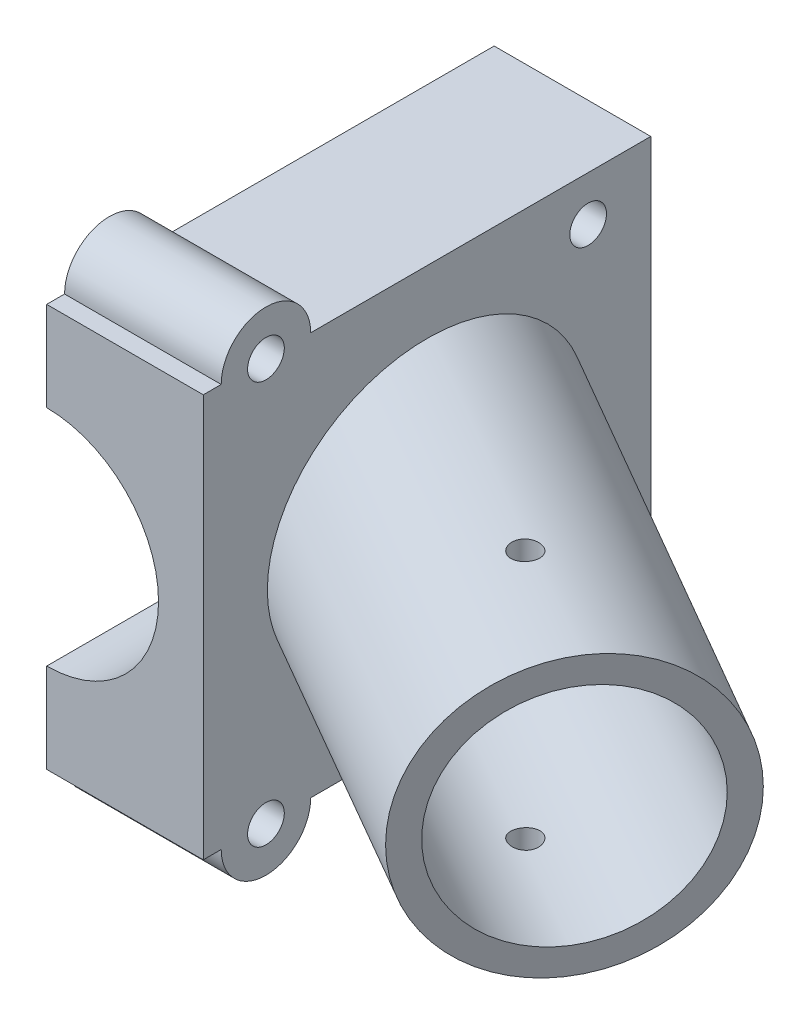
ISO-10303-21;
HEADER;
FILE_DESCRIPTION(('STEP AP214'),'2;1');
FILE_NAME('part.step','',(''),(''),'','','');
FILE_SCHEMA(('AUTOMOTIVE_DESIGN { 1 0 10303 214 1 1 1 1 }'));
ENDSEC;
DATA;
#1=APPLICATION_CONTEXT('core data for automotive mechanical design processes');
#2=APPLICATION_PROTOCOL_DEFINITION('international standard','automotive_design',2000,#1);
#3=PRODUCT_CONTEXT('',#1,'mechanical');
#4=PRODUCT('Part','Part','',(#3));
#5=PRODUCT_RELATED_PRODUCT_CATEGORY('part','',(#4));
#6=PRODUCT_DEFINITION_FORMATION('','',#4);
#7=PRODUCT_DEFINITION_CONTEXT('part definition',#1,'design');
#8=PRODUCT_DEFINITION('design','',#6,#7);
#9=PRODUCT_DEFINITION_SHAPE('','',#8);
#10=(LENGTH_UNIT() NAMED_UNIT(*) SI_UNIT(.MILLI.,.METRE.));
#11=(NAMED_UNIT(*) PLANE_ANGLE_UNIT() SI_UNIT($,.RADIAN.));
#12=(NAMED_UNIT(*) SI_UNIT($,.STERADIAN.) SOLID_ANGLE_UNIT());
#13=UNCERTAINTY_MEASURE_WITH_UNIT(LENGTH_MEASURE(1.E-05),#10,'distance_accuracy_value','');
#14=(GEOMETRIC_REPRESENTATION_CONTEXT(3) GLOBAL_UNCERTAINTY_ASSIGNED_CONTEXT((#13)) GLOBAL_UNIT_ASSIGNED_CONTEXT((#10,
#11,#12)) REPRESENTATION_CONTEXT('',''));
#15=CARTESIAN_POINT('',(0.,0.,0.));
#16=DIRECTION('',(0.,0.,1.));
#17=DIRECTION('',(1.,0.,0.));
#18=AXIS2_PLACEMENT_3D('',#15,#16,#17);
#19=CARTESIAN_POINT('',(-17.5,45.,25.));
#20=DIRECTION('',(0.,1.,0.));
#21=DIRECTION('',(0.,0.,1.));
#22=AXIS2_PLACEMENT_3D('',#19,#20,#21);
#23=PLANE('',#22);
#24=DIRECTION('',(0.,0.,1.));
#25=VECTOR('',#24,1.);
#26=CARTESIAN_POINT('',(0.,45.,-25.));
#27=LINE('',#26,#25);
#28=CARTESIAN_POINT('',(0.,45.,-25.));
#29=VERTEX_POINT('',#28);
#30=CARTESIAN_POINT('',(0.,45.,13.));
#31=VERTEX_POINT('',#30);
#32=EDGE_CURVE('E124',#29,#31,#27,.T.);
#33=ORIENTED_EDGE('',*,*,#32,.T.);
#34=DIRECTION('',(-1.,0.,0.));
#35=VECTOR('',#34,1.);
#36=CARTESIAN_POINT('',(17.5,45.,13.));
#37=LINE('',#36,#35);
#38=CARTESIAN_POINT('',(17.5,45.,13.));
#39=VERTEX_POINT('',#38);
#40=EDGE_CURVE('E54',#39,#31,#37,.T.);
#41=ORIENTED_EDGE('',*,*,#40,.F.);
#42=DIRECTION('',(0.,0.,-1.));
#43=VECTOR('',#42,1.);
#44=CARTESIAN_POINT('',(17.5,45.,25.));
#45=LINE('',#44,#43);
#46=CARTESIAN_POINT('',(17.5,45.,-25.));
#47=VERTEX_POINT('',#46);
#48=EDGE_CURVE('E286',#39,#47,#45,.T.);
#49=ORIENTED_EDGE('',*,*,#48,.T.);
#50=DIRECTION('',(1.,0.,0.));
#51=VECTOR('',#50,1.);
#52=CARTESIAN_POINT('',(-17.5,45.,-25.));
#53=LINE('',#52,#51);
#54=EDGE_CURVE('E242',#29,#47,#53,.T.);
#55=ORIENTED_EDGE('',*,*,#54,.F.);
#56=EDGE_LOOP('',(#33,#41,#49,#55));
#57=FACE_BOUND('',#56,.T.);
#58=ADVANCED_FACE('F37',(#57),#23,.T.);
#59=CARTESIAN_POINT('',(17.5,45.,25.));
#60=VERTEX_POINT('',#59);
#61=CARTESIAN_POINT('',(17.5,45.,23.));
#62=VERTEX_POINT('',#61);
#63=EDGE_CURVE('E62',#60,#62,#45,.T.);
#64=ORIENTED_EDGE('',*,*,#63,.T.);
#65=DIRECTION('',(-1.,0.,0.));
#66=VECTOR('',#65,1.);
#67=CARTESIAN_POINT('',(17.5,45.,23.));
#68=LINE('',#67,#66);
#69=CARTESIAN_POINT('',(0.,45.,23.));
#70=VERTEX_POINT('',#69);
#71=EDGE_CURVE('E128',#62,#70,#68,.T.);
#72=ORIENTED_EDGE('',*,*,#71,.T.);
#73=CARTESIAN_POINT('',(0.,45.,25.));
#74=VERTEX_POINT('',#73);
#75=EDGE_CURVE('E117',#70,#74,#27,.T.);
#76=ORIENTED_EDGE('',*,*,#75,.T.);
#77=DIRECTION('',(1.,0.,0.));
#78=VECTOR('',#77,1.);
#79=CARTESIAN_POINT('',(-17.5,45.,25.));
#80=LINE('',#79,#78);
#81=EDGE_CURVE('E288',#74,#60,#80,.T.);
#82=ORIENTED_EDGE('',*,*,#81,.T.);
#83=EDGE_LOOP('',(#64,#72,#76,#82));
#84=FACE_BOUND('',#83,.T.);
#85=ADVANCED_FACE('F129',(#84),#23,.T.);
#86=CARTESIAN_POINT('',(-17.5,0.,25.));
#87=DIRECTION('',(0.,1.,0.));
#88=DIRECTION('',(0.,0.,1.));
#89=AXIS2_PLACEMENT_3D('',#86,#87,#88);
#90=PLANE('',#89);
#91=DIRECTION('',(0.,0.,-1.));
#92=VECTOR('',#91,1.);
#93=CARTESIAN_POINT('',(17.5,0.,25.));
#94=LINE('',#93,#92);
#95=CARTESIAN_POINT('',(17.5,0.,13.));
#96=VERTEX_POINT('',#95);
#97=CARTESIAN_POINT('',(17.5,0.,-25.));
#98=VERTEX_POINT('',#97);
#99=EDGE_CURVE('E46',#96,#98,#94,.T.);
#100=ORIENTED_EDGE('',*,*,#99,.F.);
#101=DIRECTION('',(-1.,0.,0.));
#102=VECTOR('',#101,1.);
#103=CARTESIAN_POINT('',(17.5,0.,13.));
#104=LINE('',#103,#102);
#105=CARTESIAN_POINT('',(0.,0.,13.));
#106=VERTEX_POINT('',#105);
#107=EDGE_CURVE('E156',#96,#106,#104,.T.);
#108=ORIENTED_EDGE('',*,*,#107,.T.);
#109=DIRECTION('',(0.,0.,-1.));
#110=VECTOR('',#109,1.);
#111=CARTESIAN_POINT('',(0.,0.,-25.));
#112=LINE('',#111,#110);
#113=CARTESIAN_POINT('',(0.,0.,-25.));
#114=VERTEX_POINT('',#113);
#115=EDGE_CURVE('E166',#106,#114,#112,.T.);
#116=ORIENTED_EDGE('',*,*,#115,.T.);
#117=DIRECTION('',(1.,0.,0.));
#118=VECTOR('',#117,1.);
#119=CARTESIAN_POINT('',(-17.5,0.,-25.));
#120=LINE('',#119,#118);
#121=EDGE_CURVE('E260',#114,#98,#120,.T.);
#122=ORIENTED_EDGE('',*,*,#121,.T.);
#123=EDGE_LOOP('',(#100,#108,#116,#122));
#124=FACE_BOUND('',#123,.T.);
#125=ADVANCED_FACE('F239',(#124),#90,.F.);
#126=CARTESIAN_POINT('',(0.,0.,25.));
#127=VERTEX_POINT('',#126);
#128=CARTESIAN_POINT('',(0.,0.,23.));
#129=VERTEX_POINT('',#128);
#130=EDGE_CURVE('E167',#127,#129,#112,.T.);
#131=ORIENTED_EDGE('',*,*,#130,.T.);
#132=DIRECTION('',(-1.,0.,0.));
#133=VECTOR('',#132,1.);
#134=CARTESIAN_POINT('',(17.5,0.,23.));
#135=LINE('',#134,#133);
#136=CARTESIAN_POINT('',(17.5,0.,23.));
#137=VERTEX_POINT('',#136);
#138=EDGE_CURVE('E153',#137,#129,#135,.T.);
#139=ORIENTED_EDGE('',*,*,#138,.F.);
#140=CARTESIAN_POINT('',(17.5,0.,25.));
#141=VERTEX_POINT('',#140);
#142=EDGE_CURVE('E11',#141,#137,#94,.T.);
#143=ORIENTED_EDGE('',*,*,#142,.F.);
#144=DIRECTION('',(1.,0.,0.));
#145=VECTOR('',#144,1.);
#146=CARTESIAN_POINT('',(-17.5,0.,25.));
#147=LINE('',#146,#145);
#148=EDGE_CURVE('E255',#127,#141,#147,.T.);
#149=ORIENTED_EDGE('',*,*,#148,.F.);
#150=EDGE_LOOP('',(#131,#139,#143,#149));
#151=FACE_BOUND('',#150,.T.);
#152=ADVANCED_FACE('F39',(#151),#90,.F.);
#153=CARTESIAN_POINT('',(0.,22.5,25.));
#154=DIRECTION('',(0.,0.,-1.));
#155=DIRECTION('',(-1.,0.,0.));
#156=AXIS2_PLACEMENT_3D('',#153,#154,#155);
#157=CYLINDRICAL_SURFACE('',#156,12.5);
#158=DIRECTION('',(0.,0.,-1.));
#159=VECTOR('',#158,1.);
#160=CARTESIAN_POINT('',(0.,35.,25.));
#161=LINE('',#160,#159);
#162=CARTESIAN_POINT('',(0.,35.,-25.));
#163=VERTEX_POINT('',#162);
#164=CARTESIAN_POINT('',(0.,35.,25.));
#165=VERTEX_POINT('',#164);
#166=EDGE_CURVE('E174',#163,#165,#161,.F.);
#167=ORIENTED_EDGE('',*,*,#166,.F.);
#168=CARTESIAN_POINT('',(0.,22.5,-25.));
#169=DIRECTION('',(0.,0.,-1.));
#170=DIRECTION('',(1.,0.,0.));
#171=AXIS2_PLACEMENT_3D('',#168,#169,#170);
#172=CIRCLE('',#171,12.5);
#173=CARTESIAN_POINT('',(0.,10.,-25.));
#174=VERTEX_POINT('',#173);
#175=EDGE_CURVE('E250',#163,#174,#172,.T.);
#176=ORIENTED_EDGE('',*,*,#175,.T.);
#177=DIRECTION('',(0.,0.,-1.));
#178=VECTOR('',#177,1.);
#179=CARTESIAN_POINT('',(0.,10.,25.));
#180=LINE('',#179,#178);
#181=CARTESIAN_POINT('',(0.,10.,25.));
#182=VERTEX_POINT('',#181);
#183=EDGE_CURVE('E172',#182,#174,#180,.T.);
#184=ORIENTED_EDGE('',*,*,#183,.F.);
#185=CARTESIAN_POINT('',(0.,22.5,25.));
#186=DIRECTION('',(0.,0.,-1.));
#187=DIRECTION('',(1.,0.,0.));
#188=AXIS2_PLACEMENT_3D('',#185,#186,#187);
#189=CIRCLE('',#188,12.5);
#190=EDGE_CURVE('E266',#165,#182,#189,.T.);
#191=ORIENTED_EDGE('',*,*,#190,.F.);
#192=EDGE_LOOP('',(#167,#176,#184,#191));
#193=FACE_BOUND('',#192,.T.);
#194=ADVANCED_FACE('F424',(#193),#157,.F.);
#195=CARTESIAN_POINT('',(0.,22.5,25.));
#196=DIRECTION('',(0.,0.,1.));
#197=DIRECTION('',(1.,0.,0.));
#198=AXIS2_PLACEMENT_3D('',#195,#196,#197);
#199=PLANE('',#198);
#200=ORIENTED_EDGE('',*,*,#81,.F.);
#201=DIRECTION('',(0.,-1.,0.));
#202=VECTOR('',#201,1.);
#203=CARTESIAN_POINT('',(0.,45.,25.));
#204=LINE('',#203,#202);
#205=EDGE_CURVE('E122',#74,#165,#204,.T.);
#206=ORIENTED_EDGE('',*,*,#205,.T.);
#207=ORIENTED_EDGE('',*,*,#190,.T.);
#208=EDGE_CURVE('E164',#182,#127,#204,.T.);
#209=ORIENTED_EDGE('',*,*,#208,.T.);
#210=ORIENTED_EDGE('',*,*,#148,.T.);
#211=DIRECTION('',(0.,1.,0.));
#212=VECTOR('',#211,1.);
#213=CARTESIAN_POINT('',(17.5,0.,25.));
#214=LINE('',#213,#212);
#215=EDGE_CURVE('E258',#141,#60,#214,.T.);
#216=ORIENTED_EDGE('',*,*,#215,.T.);
#217=EDGE_LOOP('',(#200,#206,#207,#209,#210,#216));
#218=FACE_BOUND('',#217,.T.);
#219=ADVANCED_FACE('F433',(#218),#199,.T.);
#220=CARTESIAN_POINT('',(0.,22.5,-25.));
#221=DIRECTION('',(0.,0.,1.));
#222=DIRECTION('',(1.,0.,0.));
#223=AXIS2_PLACEMENT_3D('',#220,#221,#222);
#224=PLANE('',#223);
#225=DIRECTION('',(0.,1.,0.));
#226=VECTOR('',#225,1.);
#227=CARTESIAN_POINT('',(0.,45.,-25.));
#228=LINE('',#227,#226);
#229=EDGE_CURVE('E159',#163,#29,#228,.T.);
#230=ORIENTED_EDGE('',*,*,#229,.T.);
#231=ORIENTED_EDGE('',*,*,#54,.T.);
#232=DIRECTION('',(0.,1.,0.));
#233=VECTOR('',#232,1.);
#234=CARTESIAN_POINT('',(17.5,0.,-25.));
#235=LINE('',#234,#233);
#236=EDGE_CURVE('E256',#98,#47,#235,.T.);
#237=ORIENTED_EDGE('',*,*,#236,.F.);
#238=ORIENTED_EDGE('',*,*,#121,.F.);
#239=EDGE_CURVE('E125',#114,#174,#228,.T.);
#240=ORIENTED_EDGE('',*,*,#239,.T.);
#241=ORIENTED_EDGE('',*,*,#175,.F.);
#242=EDGE_LOOP('',(#230,#231,#237,#238,#240,#241));
#243=FACE_BOUND('',#242,.T.);
#244=ADVANCED_FACE('F231',(#243),#224,.F.);
#245=CARTESIAN_POINT('',(23.2982756057297,5.,-18.));
#246=DIRECTION('',(-1.,0.,0.));
#247=DIRECTION('',(0.,0.,1.));
#248=AXIS2_PLACEMENT_3D('',#245,#246,#247);
#249=CYLINDRICAL_SURFACE('',#248,2.05);
#250=CARTESIAN_POINT('',(17.5,5.,-18.));
#251=DIRECTION('',(-1.,0.,0.));
#252=DIRECTION('',(0.,0.,1.));
#253=AXIS2_PLACEMENT_3D('',#250,#251,#252);
#254=CIRCLE('',#253,2.05);
#255=CARTESIAN_POINT('',(17.5,5.,-15.95));
#256=VERTEX_POINT('',#255);
#257=EDGE_CURVE('E279',#256,#256,#254,.F.);
#258=ORIENTED_EDGE('',*,*,#257,.T.);
#259=EDGE_LOOP('',(#258));
#260=FACE_BOUND('',#259,.T.);
#261=CARTESIAN_POINT('',(0.,5.,-18.));
#262=DIRECTION('',(-1.,0.,0.));
#263=DIRECTION('',(0.,0.,1.));
#264=AXIS2_PLACEMENT_3D('',#261,#262,#263);
#265=CIRCLE('',#264,2.05);
#266=CARTESIAN_POINT('',(0.,5.,-15.95));
#267=VERTEX_POINT('',#266);
#268=EDGE_CURVE('E169',#267,#267,#265,.F.);
#269=ORIENTED_EDGE('',*,*,#268,.F.);
#270=EDGE_LOOP('',(#269));
#271=FACE_BOUND('',#270,.T.);
#272=ADVANCED_FACE('F228',(#260,#271),#249,.F.);
#273=CARTESIAN_POINT('',(23.2982756057297,40.,-18.));
#274=DIRECTION('',(-1.,0.,0.));
#275=DIRECTION('',(0.,0.,1.));
#276=AXIS2_PLACEMENT_3D('',#273,#274,#275);
#277=CYLINDRICAL_SURFACE('',#276,2.05);
#278=CARTESIAN_POINT('',(17.5,40.,-18.));
#279=DIRECTION('',(-1.,0.,0.));
#280=DIRECTION('',(0.,0.,1.));
#281=AXIS2_PLACEMENT_3D('',#278,#279,#280);
#282=CIRCLE('',#281,2.05);
#283=CARTESIAN_POINT('',(17.5,40.,-15.95));
#284=VERTEX_POINT('',#283);
#285=EDGE_CURVE('E289',#284,#284,#282,.T.);
#286=ORIENTED_EDGE('',*,*,#285,.F.);
#287=EDGE_LOOP('',(#286));
#288=FACE_BOUND('',#287,.T.);
#289=CARTESIAN_POINT('',(0.,40.,-18.));
#290=DIRECTION('',(-1.,0.,0.));
#291=DIRECTION('',(0.,0.,1.));
#292=AXIS2_PLACEMENT_3D('',#289,#290,#291);
#293=CIRCLE('',#292,2.05);
#294=CARTESIAN_POINT('',(0.,40.,-15.95));
#295=VERTEX_POINT('',#294);
#296=EDGE_CURVE('E41',#295,#295,#293,.T.);
#297=ORIENTED_EDGE('',*,*,#296,.T.);
#298=EDGE_LOOP('',(#297));
#299=FACE_BOUND('',#298,.T.);
#300=ADVANCED_FACE('F203',(#288,#299),#277,.F.);
#301=CARTESIAN_POINT('',(56.4711431702997,22.5,22.5));
#302=DIRECTION('',(-0.866025403784438,0.,-0.500000000000001));
#303=DIRECTION('',(-0.500000000000001,0.,0.866025403784438));
#304=AXIS2_PLACEMENT_3D('',#301,#302,#303);
#305=CYLINDRICAL_SURFACE('',#304,15.45);
#306=CARTESIAN_POINT('',(17.5,22.5,0.));
#307=DIRECTION('',(-1.,0.,0.));
#308=DIRECTION('',(0.,0.,1.));
#309=AXIS2_PLACEMENT_3D('',#306,#307,#308);
#310=ELLIPSE('',#309,17.8401233179594,15.45);
#311=CARTESIAN_POINT('',(17.5,22.5,17.8401233179594));
#312=VERTEX_POINT('',#311);
#313=EDGE_CURVE('E276',#312,#312,#310,.F.);
#314=ORIENTED_EDGE('',*,*,#313,.T.);
#315=EDGE_LOOP('',(#314));
#316=FACE_BOUND('',#315,.T.);
#317=CARTESIAN_POINT('',(56.4711431702997,22.5,22.5));
#318=DIRECTION('',(0.866025403784438,0.,0.500000000000001));
#319=DIRECTION('',(0.500000000000001,0.,-0.866025403784438));
#320=AXIS2_PLACEMENT_3D('',#317,#318,#319);
#321=CIRCLE('',#320,15.45);
#322=CARTESIAN_POINT('',(64.1961431702997,22.5,9.11990751153048));
#323=VERTEX_POINT('',#322);
#324=EDGE_CURVE('E273',#323,#323,#321,.T.);
#325=ORIENTED_EDGE('',*,*,#324,.F.);
#326=EDGE_LOOP('',(#325));
#327=FACE_BOUND('',#326,.T.);
#328=CARTESIAN_POINT('',(43.4807621135331,7.10842357001727,13.45));
#329=CARTESIAN_POINT('',(43.5675140295861,7.11220583738731,13.4500035997905));
#330=CARTESIAN_POINT('',(43.6543379159049,7.11562296943198,13.4573063746119));
#331=CARTESIAN_POINT('',(43.8256389747913,7.12133717153386,13.4863548257459));
#332=CARTESIAN_POINT('',(43.9101136080419,7.1236330708784,13.5081155423256));
#333=CARTESIAN_POINT('',(44.0742346666666,7.1268400737668,13.5654820639701));
#334=CARTESIAN_POINT('',(44.1538823985694,7.12775155366233,13.6010841029924));
#335=CARTESIAN_POINT('',(44.3060733729751,7.12808628577108,13.6851172850177));
#336=CARTESIAN_POINT('',(44.378618213825,7.12750987360376,13.733545532639));
#337=CARTESIAN_POINT('',(44.5144163267341,7.12493824207385,13.8417342891035));
#338=CARTESIAN_POINT('',(44.5776888801702,7.12294601882526,13.9014706723675));
#339=CARTESIAN_POINT('',(44.6933491155633,7.11777154157267,14.0306448646124));
#340=CARTESIAN_POINT('',(44.7457362425711,7.11458922691985,14.1000831679046));
#341=CARTESIAN_POINT('',(44.8382757589249,7.10738415379465,14.2468717888696));
#342=CARTESIAN_POINT('',(44.8783990669661,7.10335943518408,14.3242403408341));
#343=CARTESIAN_POINT('',(44.9451340363399,7.09492589936488,14.4845815900471));
#344=CARTESIAN_POINT('',(44.9717453337495,7.09051707181469,14.5675544381694));
#345=CARTESIAN_POINT('',(45.0107995600195,7.08178924834297,14.7371511879134));
#346=CARTESIAN_POINT('',(45.0231814364758,7.07747071699288,14.82378918065));
#347=CARTESIAN_POINT('',(45.0332127812373,7.06942882531759,14.9979420868246));
#348=CARTESIAN_POINT('',(45.0308623229923,7.0657054620252,15.0854569958885));
#349=CARTESIAN_POINT('',(45.0114825748386,7.05927470007383,15.2588451918395));
#350=CARTESIAN_POINT('',(44.9944600780094,7.05656683207819,15.3447192196414));
#351=CARTESIAN_POINT('',(44.946212449831,7.05247043465033,15.5124128600441));
#352=CARTESIAN_POINT('',(44.9149877423185,7.05108186585005,15.5942325935564));
#353=CARTESIAN_POINT('',(44.839390493566,7.04978398217956,15.7511174106567));
#354=CARTESIAN_POINT('',(44.7950769672907,7.04986812427901,15.82621088227));
#355=CARTESIAN_POINT('',(44.6945155892028,7.05149012310831,15.9679102178092));
#356=CARTESIAN_POINT('',(44.638267857301,7.05302796523242,16.0345161670038));
#357=CARTESIAN_POINT('',(44.5155392191141,7.05738149042844,16.1572630017084));
#358=CARTESIAN_POINT('',(44.4490738150385,7.06019525008678,16.2134194605));
#359=CARTESIAN_POINT('',(44.3077302186094,7.0667862720625,16.3138261579756));
#360=CARTESIAN_POINT('',(44.2328518131959,7.07056355878435,16.3580760950296));
#361=CARTESIAN_POINT('',(44.0764896286433,7.07867698885687,16.4335880791278));
#362=CARTESIAN_POINT('',(43.9949820945677,7.08301517811672,16.4648007160874));
#363=CARTESIAN_POINT('',(43.8278921416963,7.09175403781342,16.5131308079186));
#364=CARTESIAN_POINT('',(43.7423096327915,7.09615470963042,16.5302479509465));
#365=CARTESIAN_POINT('',(43.5691854767293,7.10453859880149,16.5499339361034));
#366=CARTESIAN_POINT('',(43.4816384135415,7.10852042792001,16.5524558076983));
#367=CARTESIAN_POINT('',(43.307330712838,7.11559857980225,16.5427380048504));
#368=CARTESIAN_POINT('',(43.2205700621672,7.11869491740496,16.530498577794));
#369=CARTESIAN_POINT('',(43.05050908725,7.12364271747174,16.4916340528664));
#370=CARTESIAN_POINT('',(42.967201126629,7.12549708174145,16.4650427520059));
#371=CARTESIAN_POINT('',(42.806216429572,7.1277603748619,16.3982425182165));
#372=CARTESIAN_POINT('',(42.7285395274213,7.12816934626555,16.3580339862223));
#373=CARTESIAN_POINT('',(42.5813608278512,7.1274965531898,16.2653490819092));
#374=CARTESIAN_POINT('',(42.5118254930822,7.12642115578963,16.2129259034996));
#375=CARTESIAN_POINT('',(42.382514820438,7.12291328205902,16.0972149293455));
#376=CARTESIAN_POINT('',(42.3227395248635,7.1204807998471,16.0339270865154));
#377=CARTESIAN_POINT('',(42.2145984550986,7.1145324995053,15.8982532987994));
#378=CARTESIAN_POINT('',(42.166238244703,7.11101615501052,15.8258629435211));
#379=CARTESIAN_POINT('',(42.0823044803245,7.10329596310843,15.6740475103476));
#380=CARTESIAN_POINT('',(42.0467312988571,7.09909209567719,15.594622227593));
#381=CARTESIAN_POINT('',(41.9892255740407,7.09044728423983,15.4305879000182));
#382=CARTESIAN_POINT('',(41.9673549306644,7.0860053614192,15.3459572017134));
#383=CARTESIAN_POINT('',(41.9381220086499,7.0774006677277,15.1742110162948));
#384=CARTESIAN_POINT('',(41.9307599020529,7.07323790016758,15.0870954997287));
#385=CARTESIAN_POINT('',(41.9307643292318,7.0656530558069,14.9126990888248));
#386=CARTESIAN_POINT('',(41.9381529941613,7.06223210051304,14.8254181425712));
#387=CARTESIAN_POINT('',(41.9675126940741,7.05652493606014,14.6533059317627));
#388=CARTESIAN_POINT('',(41.9894833662964,7.05423869867483,14.5684746063225));
#389=CARTESIAN_POINT('',(42.0472841872331,7.05106561364991,14.4040048301446));
#390=CARTESIAN_POINT('',(42.0830617549016,7.05017352097671,14.3243480019454));
#391=CARTESIAN_POINT('',(42.1674637309662,7.04987268612753,14.1721607858153));
#392=CARTESIAN_POINT('',(42.2160874187022,7.0504638607569,14.0996299984307));
#393=CARTESIAN_POINT('',(42.3246100327533,7.05305845427118,13.9639821794381));
#394=CARTESIAN_POINT('',(42.3844717661918,7.05505727287103,13.9008352924126));
#395=CARTESIAN_POINT('',(42.5138878952482,7.06023955594822,13.7854335271845));
#396=CARTESIAN_POINT('',(42.5834446009332,7.06342330306697,13.7331812523211));
#397=CARTESIAN_POINT('',(42.7304714343074,7.07063048254814,13.6409117952916));
#398=CARTESIAN_POINT('',(42.807963109147,7.07465623395722,13.6009291726495));
#399=CARTESIAN_POINT('',(42.9684708041844,7.08308956338435,13.5345357915256));
#400=CARTESIAN_POINT('',(43.0514809228602,7.08749673498069,13.5081107898494));
#401=CARTESIAN_POINT('',(43.192555190309,7.0947540852807,13.4759260490532));
#402=CARTESIAN_POINT('',(43.2497483911587,7.0976352596484,13.4662177711662));
#403=CARTESIAN_POINT('',(43.3648710543732,7.10320647854792,13.4532535286673));
#404=CARTESIAN_POINT('',(43.422800520253,7.10589652216688,13.4499975948705));
#405=CARTESIAN_POINT('',(43.4807621135331,7.10842357001727,13.45));
#406=B_SPLINE_CURVE_WITH_KNOTS('',3,(#328,#329,#330,#331,#332,#333,#334,#335,#336,#337,#338,
#339,#340,#341,#342,#343,#344,#345,#346,#347,#348,#349,#350,#351,#352,#353,#354,#355,#356,#357,
#358,#359,#360,#361,#362,#363,#364,#365,#366,#367,#368,#369,#370,#371,#372,#373,#374,#375,#376,
#377,#378,#379,#380,#381,#382,#383,#384,#385,#386,#387,#388,#389,#390,#391,#392,#393,#394,#395,
#396,#397,#398,#399,#400,#401,#402,#403,#404,#405),.UNSPECIFIED.,.T.,.F.,(4,2,2,2,2,2,2,2,2,2,2,
2,2,2,2,2,2,2,2,2,2,2,2,2,2,2,2,2,2,2,2,2,2,2,2,2,2,2,4),(0.,0.260293142464534,
0.520857486799952,0.781350984550209,1.04178572867939,1.30167098031881,1.56156947790303,
1.82207957745897,2.0825966930388,2.34422745215735,2.60585690688661,2.86736529353185,
3.12886587649076,3.389204948245,3.6495414043264,3.90948670775179,4.16943859579526,
4.43036692776713,4.69130103226855,4.95307441053401,5.21484340176925,5.47599862976599,
5.73714616918847,5.99717701182826,6.25720898142732,6.5173674319739,6.77753346091606,
7.03886644907719,7.3002025360856,7.56193101040645,7.82365297387033,8.08438789932458,
8.3451082008039,8.60498037938904,8.86491458514606,9.12557435757097,9.38595972570651,
9.55986865926971,9.73377842338315),.UNSPECIFIED.);
#407=CARTESIAN_POINT('',(43.4807621135331,7.10842357001727,13.45));
#408=VERTEX_POINT('',#407);
#409=EDGE_CURVE('E177',#408,#408,#406,.T.);
#410=ORIENTED_EDGE('',*,*,#409,.F.);
#411=EDGE_LOOP('',(#410));
#412=FACE_BOUND('',#411,.T.);
#413=CARTESIAN_POINT('',(43.4807621135331,37.8915764299827,13.45));
#414=CARTESIAN_POINT('',(43.3935968068157,37.8953777086965,13.4500036652577));
#415=CARTESIAN_POINT('',(43.3063894202571,37.8995523468866,13.4573764405702));
#416=CARTESIAN_POINT('',(43.1343978183411,37.9081776885007,13.4866731316947));
#417=CARTESIAN_POINT('',(43.0496164848263,37.912628701833,13.5086136599969));
#418=CARTESIAN_POINT('',(42.8849641464831,37.9212997886838,13.566427048775));
#419=CARTESIAN_POINT('',(42.8050910731112,37.9255199594053,13.6022939927914));
#420=CARTESIAN_POINT('',(42.6525036606227,37.9332551561894,13.6869503783984));
#421=CARTESIAN_POINT('',(42.5797875368456,37.9367703582713,13.7357365871794));
#422=CARTESIAN_POINT('',(42.4436338425,37.9426976561187,13.8448094742078));
#423=CARTESIAN_POINT('',(42.3801867090595,37.9451108943315,13.9050841495894));
#424=CARTESIAN_POINT('',(42.2643039248887,37.9485671878837,14.0354607456901));
#425=CARTESIAN_POINT('',(42.2118683565281,37.9496102329739,14.1055627399141));
#426=CARTESIAN_POINT('',(42.1197291505172,37.950206775174,14.2532530539873));
#427=CARTESIAN_POINT('',(42.0799694646575,37.949766931956,14.3308063873812));
#428=CARTESIAN_POINT('',(42.0139903577964,37.9474618445505,14.4914523908725));
#429=CARTESIAN_POINT('',(41.9877708419008,37.9455966103527,14.5745450221442));
#430=CARTESIAN_POINT('',(41.9496169860371,37.9406517192097,14.7438399517257));
#431=CARTESIAN_POINT('',(41.9376711260728,37.9375730442822,14.8300396843853));
#432=CARTESIAN_POINT('',(41.9283423037636,37.9305443984683,15.0031883027995));
#433=CARTESIAN_POINT('',(41.9309597169237,37.9265944051181,15.0901372078132));
#434=CARTESIAN_POINT('',(41.9507108241077,37.9182450869456,15.2627103484147));
#435=CARTESIAN_POINT('',(41.9679039400962,37.9138439877245,15.3483276983853));
#436=CARTESIAN_POINT('',(42.0163987925384,37.9050989383395,15.5154733047995));
#437=CARTESIAN_POINT('',(42.0477008042837,37.9007549892925,15.5970014814209));
#438=CARTESIAN_POINT('',(42.1236454884642,37.8926014402742,15.7538897603206));
#439=CARTESIAN_POINT('',(42.1683236179863,37.8887933005504,15.8292327822195));
#440=CARTESIAN_POINT('',(42.2697382347305,37.8821580205087,15.9713609102221));
#441=CARTESIAN_POINT('',(42.3264744643624,37.879330859238,16.0381461990909));
#442=CARTESIAN_POINT('',(42.4502177351765,37.8749872570702,16.1610602663448));
#443=CARTESIAN_POINT('',(42.517194145441,37.8734669938865,16.2172197437167));
#444=CARTESIAN_POINT('',(42.6596317696677,37.8718970739805,16.3175094203791));
#445=CARTESIAN_POINT('',(42.735092754891,37.8718473776221,16.3616399438531));
#446=CARTESIAN_POINT('',(42.8920235716991,37.8732213699737,16.436458637829));
#447=CARTESIAN_POINT('',(42.9734682517492,37.874639186263,16.4671996910376));
#448=CARTESIAN_POINT('',(43.1403178596144,37.878778148854,16.5146353290782));
#449=CARTESIAN_POINT('',(43.225722821667,37.8814993064253,16.5313297924504));
#450=CARTESIAN_POINT('',(43.3981864798691,37.887941631409,16.5502308792665));
#451=CARTESIAN_POINT('',(43.4852470415569,37.8916639976861,16.5524200527373));
#452=CARTESIAN_POINT('',(43.6584835815492,37.8996890020284,16.5422206096453));
#453=CARTESIAN_POINT('',(43.7446595329477,37.9039916576877,16.5298315509918));
#454=CARTESIAN_POINT('',(43.9141071719572,37.9127162177603,16.4907400965597));
#455=CARTESIAN_POINT('',(43.9973640073051,37.9171385724955,16.4639733949736));
#456=CARTESIAN_POINT('',(44.1582207872548,37.9255868829337,16.3968340716619));
#457=CARTESIAN_POINT('',(44.2358207022808,37.9296128365644,16.356461378807));
#458=CARTESIAN_POINT('',(44.3832273369879,37.9368188127603,16.2631979151317));
#459=CARTESIAN_POINT('',(44.4530277639016,37.9399981550839,16.2102971422436));
#460=CARTESIAN_POINT('',(44.5827635525666,37.9451476920565,16.0934858427298));
#461=CARTESIAN_POINT('',(44.6426991943149,37.9471179210286,16.0295756286959));
#462=CARTESIAN_POINT('',(44.7507544809289,37.9496211449747,15.8928497372571));
#463=CARTESIAN_POINT('',(44.7989217987482,37.9501600289657,15.8200718422116));
#464=CARTESIAN_POINT('',(44.8823804608364,37.9497569422176,15.6674789817399));
#465=CARTESIAN_POINT('',(44.9176720401149,37.9488149985085,15.5876641447859));
#466=CARTESIAN_POINT('',(44.9743064142215,37.9455605906345,15.423492653865));
#467=CARTESIAN_POINT('',(44.9956854037131,37.9432517128172,15.3391484081028));
#468=CARTESIAN_POINT('',(45.0240553078568,37.9375241300638,15.1681108292973));
#469=CARTESIAN_POINT('',(45.0310459137351,37.9341054013123,15.081417445882));
#470=CARTESIAN_POINT('',(45.0304597732999,37.9265273067917,14.9078581432174));
#471=CARTESIAN_POINT('',(45.0228402027159,37.922365796265,14.820992464576));
#472=CARTESIAN_POINT('',(44.9931743110798,37.913773545467,14.6497730993765));
#473=CARTESIAN_POINT('',(44.9711275769656,37.9093427974904,14.565419484813));
#474=CARTESIAN_POINT('',(44.9131072337078,37.9006900450269,14.4012543512565));
#475=CARTESIAN_POINT('',(44.8770786719427,37.8964689392687,14.3214621978148));
#476=CARTESIAN_POINT('',(44.7921068237148,37.8887320250144,14.1690443591347));
#477=CARTESIAN_POINT('',(44.7431640981875,37.8852161858961,14.0964183628177));
#478=CARTESIAN_POINT('',(44.6338074924205,37.8792934593654,13.9604877007198));
#479=CARTESIAN_POINT('',(44.5734082923613,37.8768851661363,13.8971712880846));
#480=CARTESIAN_POINT('',(44.4427927862495,37.8734460823072,13.7815568546313));
#481=CARTESIAN_POINT('',(44.3725745851666,37.872415558018,13.7292609656289));
#482=CARTESIAN_POINT('',(44.224654966727,37.871851852445,13.6374011926032));
#483=CARTESIAN_POINT('',(44.146985233444,37.8723125821743,13.5977862574798));
#484=CARTESIAN_POINT('',(43.9861879392938,37.87466606038,13.5321547233154));
#485=CARTESIAN_POINT('',(43.9030664619719,37.8765572366542,13.506123247755));
#486=CARTESIAN_POINT('',(43.7630290726142,37.8806858657224,13.4748589428218));
#487=CARTESIAN_POINT('',(43.7069790178939,37.8825780542684,13.4655477767588));
#488=CARTESIAN_POINT('',(43.5942126218968,37.8867862481503,13.4531171150887));
#489=CARTESIAN_POINT('',(43.5374962811714,37.8891022531352,13.4499976143565));
#490=CARTESIAN_POINT('',(43.4807621135331,37.8915764299827,13.45));
#491=B_SPLINE_CURVE_WITH_KNOTS('',3,(#413,#414,#415,#416,#417,#418,#419,#420,#421,#422,#423,
#424,#425,#426,#427,#428,#429,#430,#431,#432,#433,#434,#435,#436,#437,#438,#439,#440,#441,#442,
#443,#444,#445,#446,#447,#448,#449,#450,#451,#452,#453,#454,#455,#456,#457,#458,#459,#460,#461,
#462,#463,#464,#465,#466,#467,#468,#469,#470,#471,#472,#473,#474,#475,#476,#477,#478,#479,#480,
#481,#482,#483,#484,#485,#486,#487,#488,#489,#490),.UNSPECIFIED.,.T.,.F.,(4,2,2,2,2,2,2,2,2,2,2,
2,2,2,2,2,2,2,2,2,2,2,2,2,2,2,2,2,2,2,2,2,2,2,2,2,2,2,4),(0.,0.261537500795967,
0.523373762044006,0.785098906999723,1.04675862181308,1.3081464448454,1.56953622306718,
1.8297536627319,2.08996927867951,2.34997473739057,2.60998690021349,2.87106420185257,
3.13214659783199,3.39392728626001,3.65570238298169,3.91670923528528,4.17770905268674,
4.43766847213473,4.69763013940627,4.95790448582965,5.21818672538176,5.47964292309189,
5.74110048766177,6.00276750053443,6.26442708510327,6.5250084376418,6.78558503377929,
7.04548098080903,7.30538250513128,7.56604699829245,7.82671895482446,8.08842597623576,
8.35012163209637,8.61148419254808,8.87289726479197,9.13324430156295,9.39330560626544,
9.56353531410158,9.73376488103154),.UNSPECIFIED.);
#492=CARTESIAN_POINT('',(43.4807621135331,37.8915764299827,13.45));
#493=VERTEX_POINT('',#492);
#494=EDGE_CURVE('E185',#493,#493,#491,.T.);
#495=ORIENTED_EDGE('',*,*,#494,.F.);
#496=EDGE_LOOP('',(#495));
#497=FACE_BOUND('',#496,.T.);
#498=ADVANCED_FACE('F191',(#316,#327,#412,#497),#305,.T.);
#499=CARTESIAN_POINT('',(56.4711431702997,22.5,22.5));
#500=DIRECTION('',(-0.866025403784438,0.,-0.500000000000001));
#501=DIRECTION('',(-0.500000000000001,0.,0.866025403784438));
#502=AXIS2_PLACEMENT_3D('',#499,#500,#501);
#503=CYLINDRICAL_SURFACE('',#502,12.5);
#504=CARTESIAN_POINT('',(26.3480762113533,22.5,5.10843918243519));
#505=DIRECTION('',(0.866025403784439,0.,0.5));
#506=DIRECTION('',(0.5,0.,-0.866025403784439));
#507=AXIS2_PLACEMENT_3D('',#504,#505,#506);
#508=CIRCLE('',#507,12.5);
#509=CARTESIAN_POINT('',(32.5980762113533,22.5,-5.71687836487028));
#510=VERTEX_POINT('',#509);
#511=EDGE_CURVE('E282',#510,#510,#508,.T.);
#512=ORIENTED_EDGE('',*,*,#511,.F.);
#513=EDGE_LOOP('',(#512));
#514=FACE_BOUND('',#513,.T.);
#515=CARTESIAN_POINT('',(56.4711431702997,22.5,22.5));
#516=DIRECTION('',(-0.866025403784438,0.,-0.500000000000001));
#517=DIRECTION('',(0.500000000000001,0.,-0.866025403784438));
#518=AXIS2_PLACEMENT_3D('',#515,#516,#517);
#519=CIRCLE('',#518,12.5);
#520=CARTESIAN_POINT('',(62.7211431702997,22.5,11.6746824526946));
#521=VERTEX_POINT('',#520);
#522=EDGE_CURVE('E265',#521,#521,#519,.T.);
#523=ORIENTED_EDGE('',*,*,#522,.F.);
#524=EDGE_LOOP('',(#523));
#525=FACE_BOUND('',#524,.T.);
#526=CARTESIAN_POINT('',(43.4807621135331,10.0722839990608,13.45));
#527=CARTESIAN_POINT('',(43.3935431740241,10.0675732895367,13.4500035527723));
#528=CARTESIAN_POINT('',(43.3062933002869,10.062401182317,13.4573850214386));
#529=CARTESIAN_POINT('',(43.1342291429431,10.0517183172541,13.4867096842604));
#530=CARTESIAN_POINT('',(43.0494176684796,10.0462071901129,13.5086690225333));
#531=CARTESIAN_POINT('',(42.8847027987323,10.0354734308515,13.566533289074));
#532=CARTESIAN_POINT('',(42.8047974758921,10.0302506855125,13.6024326993568));
#533=CARTESIAN_POINT('',(42.652141424148,10.0206801222833,13.6871756326653));
#534=CARTESIAN_POINT('',(42.579388904499,10.0163320851181,13.7360159045002));
#535=CARTESIAN_POINT('',(42.443207505998,10.0090055027901,13.845191226054));
#536=CARTESIAN_POINT('',(42.3797633646066,10.0060246983747,13.905507078118));
#537=CARTESIAN_POINT('',(42.2638902392804,10.0017587736018,14.0359799211424));
#538=CARTESIAN_POINT('',(42.2114611533439,10.0004736375415,14.1061368209626));
#539=CARTESIAN_POINT('',(42.1194577872544,9.999747119031,14.2537667866703));
#540=CARTESIAN_POINT('',(42.0797982449823,10.0002932173006,14.331186672049));
#541=CARTESIAN_POINT('',(42.013972463137,10.0031402695473,14.4915326670342));
#542=CARTESIAN_POINT('',(41.9878060955109,10.0054412068701,14.5744587243777));
#543=CARTESIAN_POINT('',(41.9497103344234,10.0115372652614,14.7433559248158));
#544=CARTESIAN_POINT('',(41.9377635866414,10.0153305574446,14.829323223943));
#545=CARTESIAN_POINT('',(41.9283534225663,10.0239911012432,15.0019931796783));
#546=CARTESIAN_POINT('',(41.9308905804515,10.0288583954274,15.0886958653028));
#547=CARTESIAN_POINT('',(41.9504174699341,10.0391619947354,15.2609733975037));
#548=CARTESIAN_POINT('',(41.9674971716351,10.0446016569073,15.3465378480124));
#549=CARTESIAN_POINT('',(42.0157462618068,10.055417547136,15.5136037184463));
#550=CARTESIAN_POINT('',(42.046916070991,10.0607937732937,15.59510501697));
#551=CARTESIAN_POINT('',(42.1226451885873,10.0709006241721,15.7520931538927));
#552=CARTESIAN_POINT('',(42.1672590690109,10.0756285010996,15.8275538616764));
#553=CARTESIAN_POINT('',(42.268588947644,10.0838727682872,15.9699331842312));
#554=CARTESIAN_POINT('',(42.3253045502467,10.0873891981398,16.0368520781209));
#555=CARTESIAN_POINT('',(42.4489596512426,10.0927933111379,16.1599396127872));
#556=CARTESIAN_POINT('',(42.5158524803482,10.0946881799928,16.2161548142002));
#557=CARTESIAN_POINT('',(42.658137737455,10.0966571542126,16.3165753660165));
#558=CARTESIAN_POINT('',(42.7335298125616,10.0967313351456,16.3607812147969));
#559=CARTESIAN_POINT('',(42.8901608092997,10.0950558340864,16.4356811079212));
#560=CARTESIAN_POINT('',(42.9713610916933,10.0933173201815,16.4664562515927));
#561=CARTESIAN_POINT('',(43.1377076399532,10.0882318981854,16.5140335786766));
#562=CARTESIAN_POINT('',(43.2228539575262,10.0848849690132,16.5308355789382));
#563=CARTESIAN_POINT('',(43.3948522890907,10.076953682445,16.5500391705441));
#564=CARTESIAN_POINT('',(43.4817071088156,10.072367098574,16.5524146693086));
#565=CARTESIAN_POINT('',(43.6545572729794,10.0624736946546,16.5426565541682));
#566=CARTESIAN_POINT('',(43.7405525777152,10.0571668414988,16.5305222731154));
#567=CARTESIAN_POINT('',(43.909894569979,10.0463857498484,16.4919577618741));
#568=CARTESIAN_POINT('',(43.9932188518461,10.0409106081721,16.4654293348891));
#569=CARTESIAN_POINT('',(44.1542593164115,10.0304423469981,16.3987482520238));
#570=CARTESIAN_POINT('',(44.2319754505364,10.0254492316754,16.3585954781572));
#571=CARTESIAN_POINT('',(44.3797000252927,10.0164993763299,16.2657141200711));
#572=CARTESIAN_POINT('',(44.4496984681793,10.0125439716542,16.2129694973961));
#573=CARTESIAN_POINT('',(44.5798574934826,10.0061248639,16.0964123992973));
#574=CARTESIAN_POINT('',(44.640018505372,10.0036610956883,16.0326004072924));
#575=CARTESIAN_POINT('',(44.748414067059,10.000514421145,15.896159863051));
#576=CARTESIAN_POINT('',(44.7967209109748,9.99982046441522,15.8235889962626));
#577=CARTESIAN_POINT('',(44.8805044959843,10.0002593178603,15.6713916395814));
#578=CARTESIAN_POINT('',(44.9159815887192,10.0013920779633,15.5917653431403));
#579=CARTESIAN_POINT('',(44.9729875680561,10.0053488573964,15.428071065986));
#580=CARTESIAN_POINT('',(44.9945721049148,10.0081660406671,15.3440222841063));
#581=CARTESIAN_POINT('',(45.0234384902365,10.015173028983,15.173559672445));
#582=CARTESIAN_POINT('',(45.0307198983984,10.019362876279,15.0871457699396));
#583=CARTESIAN_POINT('',(45.0308041474398,10.0286727905671,14.913980837993));
#584=CARTESIAN_POINT('',(45.0235431209513,10.0337968706823,14.8272299987694));
#585=CARTESIAN_POINT('',(44.9946352084568,10.044393808107,14.6561795457531));
#586=CARTESIAN_POINT('',(44.9729877022151,10.0498666804446,14.5718800378069));
#587=CARTESIAN_POINT('',(44.9157312037779,10.0605852497811,14.4075654139929));
#588=CARTESIAN_POINT('',(44.8800378501728,10.0658293573252,14.3275795704186));
#589=CARTESIAN_POINT('',(44.795683635099,10.075460457213,14.1747110974341));
#590=CARTESIAN_POINT('',(44.7470233551469,10.079847487978,14.1018281496866));
#591=CARTESIAN_POINT('',(44.6381883725698,10.0872566035119,13.9653658789512));
#592=CARTESIAN_POINT('',(44.578034134494,10.0902810825897,13.9017703698494));
#593=CARTESIAN_POINT('',(44.4478426912862,10.0946282614513,13.7855583720956));
#594=CARTESIAN_POINT('',(44.3778038701239,10.0959506826072,13.7329436821911));
#595=CARTESIAN_POINT('',(44.2303586253236,10.0967375432063,13.6405410045649));
#596=CARTESIAN_POINT('',(44.1530030720786,10.096214008514,13.60067183422));
#597=CARTESIAN_POINT('',(43.9928015859651,10.0933950037271,13.5344582064297));
#598=CARTESIAN_POINT('',(43.9099614645433,10.091101382591,13.5080996841076));
#599=CARTESIAN_POINT('',(43.7690428783083,10.0860184289417,13.4759378258861));
#600=CARTESIAN_POINT('',(43.7118104869376,10.0836421965494,13.4662221306827));
#601=CARTESIAN_POINT('',(43.5966439866353,10.0783398658782,13.4532520369212));
#602=CARTESIAN_POINT('',(43.5387098775738,10.0754137674977,13.4499976395584));
#603=CARTESIAN_POINT('',(43.4807621135331,10.0722839990608,13.45));
#604=B_SPLINE_CURVE_WITH_KNOTS('',3,(#526,#527,#528,#529,#530,#531,#532,#533,#534,#535,#536,
#537,#538,#539,#540,#541,#542,#543,#544,#545,#546,#547,#548,#549,#550,#551,#552,#553,#554,#555,
#556,#557,#558,#559,#560,#561,#562,#563,#564,#565,#566,#567,#568,#569,#570,#571,#572,#573,#574,
#575,#576,#577,#578,#579,#580,#581,#582,#583,#584,#585,#586,#587,#588,#589,#590,#591,#592,#593,
#594,#595,#596,#597,#598,#599,#600,#601,#602,#603),.UNSPECIFIED.,.T.,.F.,(4,2,2,2,2,2,2,2,2,2,2,
2,2,2,2,2,2,2,2,2,2,2,2,2,2,2,2,2,2,2,2,2,2,2,2,2,2,2,4),(0.,0.261826822508398,
0.523944087324023,0.785957702231822,1.04790555259371,1.30941897986946,1.57092998536857,
1.83065681916386,2.0903811880572,2.34978825051721,2.60920559659486,2.87023963520769,
3.13128146849834,3.39339752923829,3.65550502268514,3.91644492017959,4.17737398725326,
4.4367049053264,4.69603922248877,4.95584244689146,5.21565761729462,5.47726794826619,
5.73888054482851,6.00082815662304,6.26276432951384,6.5230609687723,6.78335047321021,
7.04259072200926,7.3018389510202,7.56222824132468,7.82262875836469,8.08461775370622,
8.34659500182983,8.60811008416535,8.86966797123216,9.1295250420938,9.38911104389076,
9.56306725350255,9.73702349529633),.UNSPECIFIED.);
#605=CARTESIAN_POINT('',(43.4807621135331,10.0722839990608,13.45));
#606=VERTEX_POINT('',#605);
#607=EDGE_CURVE('E176',#606,#606,#604,.T.);
#608=ORIENTED_EDGE('',*,*,#607,.F.);
#609=EDGE_LOOP('',(#608));
#610=FACE_BOUND('',#609,.T.);
#611=CARTESIAN_POINT('',(43.4807621135331,34.9277160009392,13.45));
#612=CARTESIAN_POINT('',(43.567348781805,34.92304060689,13.450003443994));
#613=CARTESIAN_POINT('',(43.6540120730876,34.9188144663537,13.4572779359644));
#614=CARTESIAN_POINT('',(43.8250198020213,34.9117425435217,13.486223110482));
#615=CARTESIAN_POINT('',(43.9093619430579,34.9088980850381,13.5079075525294));
#616=CARTESIAN_POINT('',(44.0732635695335,34.9049181335843,13.5650884901948));
#617=CARTESIAN_POINT('',(44.1528238295078,34.9037823631329,13.6005827419996));
#618=CARTESIAN_POINT('',(44.3048727205907,34.9033500616806,13.6843724370526));
#619=CARTESIAN_POINT('',(44.3773628593207,34.9040531376736,13.7326651429786));
#620=CARTESIAN_POINT('',(44.5130002820792,34.9072114308993,13.8404890598107));
#621=CARTESIAN_POINT('',(44.576177515146,34.9096608768319,13.8999827789323));
#622=CARTESIAN_POINT('',(44.6917098971755,34.9160276252441,14.028619418184));
#623=CARTESIAN_POINT('',(44.7440644287057,34.9199450114336,14.0977628884534));
#624=CARTESIAN_POINT('',(44.8366759855923,34.9288232552164,14.2440131635286));
#625=CARTESIAN_POINT('',(44.8768889053801,34.9337878084471,14.3211476660391));
#626=CARTESIAN_POINT('',(44.9438659580279,34.9441958314272,14.4810208899496));
#627=CARTESIAN_POINT('',(44.9706295247403,34.9496393213259,14.5637598471017));
#628=CARTESIAN_POINT('',(45.0101008738773,34.9604352952098,14.7331082944923));
#629=CARTESIAN_POINT('',(45.0227153380522,34.9657869483878,14.8197396072503));
#630=CARTESIAN_POINT('',(45.0332041573108,34.9757610401339,14.9939329295383));
#631=CARTESIAN_POINT('',(45.0310786035557,34.9803834832118,15.0814949333092));
#632=CARTESIAN_POINT('',(45.0121269910879,34.9883763299608,15.2550165116011));
#633=CARTESIAN_POINT('',(44.9953105705326,34.9917475524477,15.3409770989986));
#634=CARTESIAN_POINT('',(44.94744279921,34.996861165659,15.5088892428058));
#635=CARTESIAN_POINT('',(44.9163921070711,34.9986036317358,15.5908409845131));
#636=CARTESIAN_POINT('',(44.8411922669693,35.0002567534653,15.7478329858717));
#637=CARTESIAN_POINT('',(44.7971331151337,35.00017971676,15.8229162357197));
#638=CARTESIAN_POINT('',(44.6971006069004,34.9982329040847,15.9646470817896));
#639=CARTESIAN_POINT('',(44.641127433116,34.996363155591,16.0312948072829));
#640=CARTESIAN_POINT('',(44.519018048121,34.9910465606072,16.154126117756));
#641=CARTESIAN_POINT('',(44.4529060126794,34.9876034281162,16.2103339093579));
#642=CARTESIAN_POINT('',(44.3122931649307,34.9795230116194,16.3109270197872));
#643=CARTESIAN_POINT('',(44.2377920371489,34.974885682697,16.3553118937982));
#644=CARTESIAN_POINT('',(44.0820382977682,34.9649002795009,16.4312639183699));
#645=CARTESIAN_POINT('',(44.0007497979778,34.9595483241177,16.4627569600836));
#646=CARTESIAN_POINT('',(43.8340535838922,34.948750191541,16.5116982031048));
#647=CARTESIAN_POINT('',(43.7486457269268,34.9433040110882,16.5291459175937));
#648=CARTESIAN_POINT('',(43.5756500617078,34.9329001825246,16.5495546161245));
#649=CARTESIAN_POINT('',(43.488053505424,34.9279451064667,16.552442912955));
#650=CARTESIAN_POINT('',(43.3135685561318,34.9191185003456,16.5434303560103));
#651=CARTESIAN_POINT('',(43.2266801453212,34.9152469429616,16.5315298751735));
#652=CARTESIAN_POINT('',(43.0563912026268,34.9090431273549,16.4933175234261));
#653=CARTESIAN_POINT('',(42.9729795878188,34.9067055606427,16.4670559349953));
#654=CARTESIAN_POINT('',(42.8117252063121,34.9038178565383,16.4008868856221));
#655=CARTESIAN_POINT('',(42.7338821863784,34.9032676378149,16.3609800456828));
#656=CARTESIAN_POINT('',(42.5864984154181,34.9040155375352,16.2689720307113));
#657=CARTESIAN_POINT('',(42.5169063545792,34.9053015047884,16.2169529117269));
#658=CARTESIAN_POINT('',(42.3874011131771,34.9095528713296,16.1020682622208));
#659=CARTESIAN_POINT('',(42.327487989508,34.9125182804892,16.0392026679467));
#660=CARTESIAN_POINT('',(42.2189758290729,34.9197946290925,15.9043721895983));
#661=CARTESIAN_POINT('',(42.1703839600489,34.9241064169386,15.8324015851821));
#662=CARTESIAN_POINT('',(42.0858918436538,34.9335906111979,15.6814118009246));
#663=CARTESIAN_POINT('',(42.0499921618527,34.9387630559473,15.6023923071777));
#664=CARTESIAN_POINT('',(41.9916623454424,34.9494296487562,15.4389343308804));
#665=CARTESIAN_POINT('',(41.969326237781,34.9549257591455,15.3544624124314));
#666=CARTESIAN_POINT('',(41.939135444171,34.9655912591002,15.1829472038078));
#667=CARTESIAN_POINT('',(41.931281022569,34.9707606426998,15.0959038667245));
#668=CARTESIAN_POINT('',(41.9302918831591,34.9802054078019,14.9214698837646));
#669=CARTESIAN_POINT('',(41.9371928705453,34.9844785932093,14.8340789073499));
#670=CARTESIAN_POINT('',(41.9656206957141,34.9916325767937,14.6616502393128));
#671=CARTESIAN_POINT('',(41.9871469662168,34.9945134289687,14.5766124565488));
#672=CARTESIAN_POINT('',(42.0440679612913,34.9985447556704,14.4118107272265));
#673=CARTESIAN_POINT('',(42.0793831136134,34.9997049784221,14.3320195367747));
#674=CARTESIAN_POINT('',(42.1628823365896,35.0001954732631,14.179480646449));
#675=CARTESIAN_POINT('',(42.2110655652232,34.9995258650605,14.1067324861399));
#676=CARTESIAN_POINT('',(42.3186417307795,34.9964402834631,13.9706998054821));
#677=CARTESIAN_POINT('',(42.3779774403333,34.9940330547729,13.9073698048814));
#678=CARTESIAN_POINT('',(42.5063401551214,34.9877489717206,13.7914972981114));
#679=CARTESIAN_POINT('',(42.5753694053747,34.9838717765605,13.7389572978613));
#680=CARTESIAN_POINT('',(42.7214370119965,34.9750603247373,13.6459490615603));
#681=CARTESIAN_POINT('',(42.7985052455904,34.9701220468792,13.6055281896295));
#682=CARTESIAN_POINT('',(42.9582292509856,34.9597489323779,13.5381662026202));
#683=CARTESIAN_POINT('',(43.0408795193537,34.9543145830144,13.5112120244977));
#684=CARTESIAN_POINT('',(43.1833617853486,34.945218352923,13.4776213281798));
#685=CARTESIAN_POINT('',(43.2423458915267,34.9415280610053,13.467279334017));
#686=CARTESIAN_POINT('',(43.3611285026989,34.9343923331277,13.4534674582711));
#687=CARTESIAN_POINT('',(43.4209270128296,34.930946898713,13.4499976200524));
#688=CARTESIAN_POINT('',(43.4807621135331,34.9277160009392,13.45));
#689=B_SPLINE_CURVE_WITH_KNOTS('',3,(#611,#612,#613,#614,#615,#616,#617,#618,#619,#620,#621,
#622,#623,#624,#625,#626,#627,#628,#629,#630,#631,#632,#633,#634,#635,#636,#637,#638,#639,#640,
#641,#642,#643,#644,#645,#646,#647,#648,#649,#650,#651,#652,#653,#654,#655,#656,#657,#658,#659,
#660,#661,#662,#663,#664,#665,#666,#667,#668,#669,#670,#671,#672,#673,#674,#675,#676,#677,#678,
#679,#680,#681,#682,#683,#684,#685,#686,#687,#688),.UNSPECIFIED.,.T.,.F.,(4,2,2,2,2,2,2,2,2,2,2,
2,2,2,2,2,2,2,2,2,2,2,2,2,2,2,2,2,2,2,2,2,2,2,2,2,2,2,4),(0.,0.259922739967789,
0.520094027346437,0.78022305982467,1.04029650097064,1.29951442701812,1.55874713730726,
1.81891050905029,2.07908483139674,2.34096518526699,2.60284391951256,2.86455097331422,
3.12624591899165,3.38617119464258,3.64609248654855,3.90540337428493,4.16472401675811,
4.42551511298237,4.68631524797654,4.94841613482536,5.21051041223574,5.47169284164763,
5.73286338608261,5.99231359065943,6.25176532026419,6.51138087093283,6.77100798874022,
7.03241496645747,7.29382671581063,7.55587174607111,7.81790661280834,8.07845117308582,
8.33897868884699,8.59820414090368,8.85748972876071,9.11777583242963,9.37780895918829,
9.55742558485831,9.7370433439373),.UNSPECIFIED.);
#690=CARTESIAN_POINT('',(43.4807621135331,34.9277160009392,13.45));
#691=VERTEX_POINT('',#690);
#692=EDGE_CURVE('E186',#691,#691,#689,.T.);
#693=ORIENTED_EDGE('',*,*,#692,.F.);
#694=EDGE_LOOP('',(#693));
#695=FACE_BOUND('',#694,.T.);
#696=ADVANCED_FACE('F216',(#514,#525,#610,#695),#503,.F.);
#697=CARTESIAN_POINT('',(17.5,0.,25.));
#698=DIRECTION('',(-1.,0.,0.));
#699=DIRECTION('',(0.,0.,1.));
#700=AXIS2_PLACEMENT_3D('',#697,#698,#699);
#701=PLANE('',#700);
#702=CARTESIAN_POINT('',(17.5,45.,18.));
#703=DIRECTION('',(-1.,0.,0.));
#704=DIRECTION('',(0.,0.,1.));
#705=AXIS2_PLACEMENT_3D('',#702,#703,#704);
#706=CIRCLE('',#705,2.05);
#707=CARTESIAN_POINT('',(17.5,45.,20.05));
#708=VERTEX_POINT('',#707);
#709=EDGE_CURVE('E136',#708,#708,#706,.T.);
#710=ORIENTED_EDGE('',*,*,#709,.T.);
#711=EDGE_LOOP('',(#710));
#712=FACE_BOUND('',#711,.T.);
#713=CARTESIAN_POINT('',(17.5,0.,18.));
#714=DIRECTION('',(-1.,0.,0.));
#715=DIRECTION('',(0.,0.,1.));
#716=AXIS2_PLACEMENT_3D('',#713,#714,#715);
#717=CIRCLE('',#716,2.05);
#718=CARTESIAN_POINT('',(17.5,0.,20.05));
#719=VERTEX_POINT('',#718);
#720=EDGE_CURVE('E146',#719,#719,#717,.F.);
#721=ORIENTED_EDGE('',*,*,#720,.F.);
#722=EDGE_LOOP('',(#721));
#723=FACE_BOUND('',#722,.T.);
#724=ORIENTED_EDGE('',*,*,#285,.T.);
#725=EDGE_LOOP('',(#724));
#726=FACE_BOUND('',#725,.T.);
#727=ORIENTED_EDGE('',*,*,#257,.F.);
#728=EDGE_LOOP('',(#727));
#729=FACE_BOUND('',#728,.T.);
#730=ORIENTED_EDGE('',*,*,#236,.T.);
#731=ORIENTED_EDGE('',*,*,#48,.F.);
#732=CARTESIAN_POINT('',(17.5,45.,18.));
#733=DIRECTION('',(1.,0.,0.));
#734=DIRECTION('',(0.,0.,-1.));
#735=AXIS2_PLACEMENT_3D('',#732,#733,#734);
#736=CIRCLE('',#735,5.);
#737=EDGE_CURVE('E135',#39,#62,#736,.T.);
#738=ORIENTED_EDGE('',*,*,#737,.T.);
#739=ORIENTED_EDGE('',*,*,#63,.F.);
#740=ORIENTED_EDGE('',*,*,#215,.F.);
#741=ORIENTED_EDGE('',*,*,#142,.T.);
#742=CARTESIAN_POINT('',(17.5,0.,18.));
#743=DIRECTION('',(-1.,0.,0.));
#744=DIRECTION('',(0.,0.,-1.));
#745=AXIS2_PLACEMENT_3D('',#742,#743,#744);
#746=CIRCLE('',#745,5.);
#747=EDGE_CURVE('E150',#96,#137,#746,.T.);
#748=ORIENTED_EDGE('',*,*,#747,.F.);
#749=ORIENTED_EDGE('',*,*,#99,.T.);
#750=EDGE_LOOP('',(#730,#731,#738,#739,#740,#741,#748,#749));
#751=FACE_BOUND('',#750,.T.);
#752=ORIENTED_EDGE('',*,*,#313,.F.);
#753=EDGE_LOOP('',(#752));
#754=FACE_BOUND('',#753,.T.);
#755=ADVANCED_FACE('F220',(#712,#723,#726,#729,#751,#754),#701,.F.);
#756=CARTESIAN_POINT('',(56.4711431702997,22.5,22.5));
#757=DIRECTION('',(0.866025403784438,0.,0.500000000000001));
#758=DIRECTION('',(0.500000000000001,0.,-0.866025403784438));
#759=AXIS2_PLACEMENT_3D('',#756,#757,#758);
#760=PLANE('',#759);
#761=ORIENTED_EDGE('',*,*,#324,.T.);
#762=EDGE_LOOP('',(#761));
#763=FACE_BOUND('',#762,.T.);
#764=ORIENTED_EDGE('',*,*,#522,.T.);
#765=EDGE_LOOP('',(#764));
#766=FACE_BOUND('',#765,.T.);
#767=ADVANCED_FACE('F222',(#763,#766),#760,.T.);
#768=CARTESIAN_POINT('',(26.3480762113533,22.5,5.10843918243519));
#769=DIRECTION('',(0.866025403784439,0.,0.5));
#770=DIRECTION('',(0.5,0.,-0.866025403784439));
#771=AXIS2_PLACEMENT_3D('',#768,#769,#770);
#772=PLANE('',#771);
#773=ORIENTED_EDGE('',*,*,#511,.T.);
#774=EDGE_LOOP('',(#773));
#775=FACE_BOUND('',#774,.T.);
#776=ADVANCED_FACE('F226',(#775),#772,.T.);
#777=CARTESIAN_POINT('',(43.4807621135331,45.,15.));
#778=DIRECTION('',(0.,-1.,0.));
#779=DIRECTION('',(0.,0.,-1.));
#780=AXIS2_PLACEMENT_3D('',#777,#778,#779);
#781=CYLINDRICAL_SURFACE('',#780,1.55);
#782=ORIENTED_EDGE('',*,*,#607,.T.);
#783=EDGE_LOOP('',(#782));
#784=FACE_BOUND('',#783,.T.);
#785=ORIENTED_EDGE('',*,*,#409,.T.);
#786=EDGE_LOOP('',(#785));
#787=FACE_BOUND('',#786,.T.);
#788=ADVANCED_FACE('F200',(#784,#787),#781,.F.);
#789=ORIENTED_EDGE('',*,*,#692,.T.);
#790=EDGE_LOOP('',(#789));
#791=FACE_BOUND('',#790,.T.);
#792=ORIENTED_EDGE('',*,*,#494,.T.);
#793=EDGE_LOOP('',(#792));
#794=FACE_BOUND('',#793,.T.);
#795=ADVANCED_FACE('F195',(#791,#794),#781,.F.);
#796=CARTESIAN_POINT('',(0.,0.,0.));
#797=DIRECTION('',(-1.,0.,0.));
#798=DIRECTION('',(0.,0.,1.));
#799=AXIS2_PLACEMENT_3D('',#796,#797,#798);
#800=PLANE('',#799);
#801=CARTESIAN_POINT('',(0.,45.,18.));
#802=DIRECTION('',(1.,0.,0.));
#803=DIRECTION('',(0.,0.,1.));
#804=AXIS2_PLACEMENT_3D('',#801,#802,#803);
#805=CIRCLE('',#804,2.05);
#806=CARTESIAN_POINT('',(0.,45.,20.05));
#807=VERTEX_POINT('',#806);
#808=EDGE_CURVE('E140',#807,#807,#805,.T.);
#809=ORIENTED_EDGE('',*,*,#808,.T.);
#810=EDGE_LOOP('',(#809));
#811=FACE_BOUND('',#810,.T.);
#812=ORIENTED_EDGE('',*,*,#296,.F.);
#813=EDGE_LOOP('',(#812));
#814=FACE_BOUND('',#813,.T.);
#815=ORIENTED_EDGE('',*,*,#166,.T.);
#816=ORIENTED_EDGE('',*,*,#205,.F.);
#817=ORIENTED_EDGE('',*,*,#75,.F.);
#818=CARTESIAN_POINT('',(0.,45.,18.));
#819=DIRECTION('',(1.,0.,0.));
#820=DIRECTION('',(0.,0.,-1.));
#821=AXIS2_PLACEMENT_3D('',#818,#819,#820);
#822=CIRCLE('',#821,5.);
#823=EDGE_CURVE('E120',#31,#70,#822,.T.);
#824=ORIENTED_EDGE('',*,*,#823,.F.);
#825=ORIENTED_EDGE('',*,*,#32,.F.);
#826=ORIENTED_EDGE('',*,*,#229,.F.);
#827=EDGE_LOOP('',(#815,#816,#817,#824,#825,#826));
#828=FACE_BOUND('',#827,.T.);
#829=ADVANCED_FACE('F118',(#811,#814,#828),#800,.T.);
#830=CARTESIAN_POINT('',(0.,0.,18.));
#831=DIRECTION('',(-1.,0.,0.));
#832=DIRECTION('',(0.,0.,1.));
#833=AXIS2_PLACEMENT_3D('',#830,#831,#832);
#834=CIRCLE('',#833,2.05);
#835=CARTESIAN_POINT('',(0.,0.,20.05));
#836=VERTEX_POINT('',#835);
#837=EDGE_CURVE('E132',#836,#836,#834,.T.);
#838=ORIENTED_EDGE('',*,*,#837,.F.);
#839=EDGE_LOOP('',(#838));
#840=FACE_BOUND('',#839,.T.);
#841=ORIENTED_EDGE('',*,*,#268,.T.);
#842=EDGE_LOOP('',(#841));
#843=FACE_BOUND('',#842,.T.);
#844=ORIENTED_EDGE('',*,*,#183,.T.);
#845=ORIENTED_EDGE('',*,*,#239,.F.);
#846=ORIENTED_EDGE('',*,*,#115,.F.);
#847=CARTESIAN_POINT('',(0.,0.,18.));
#848=DIRECTION('',(-1.,0.,0.));
#849=DIRECTION('',(0.,0.,-1.));
#850=AXIS2_PLACEMENT_3D('',#847,#848,#849);
#851=CIRCLE('',#850,5.);
#852=EDGE_CURVE('E149',#106,#129,#851,.T.);
#853=ORIENTED_EDGE('',*,*,#852,.T.);
#854=ORIENTED_EDGE('',*,*,#130,.F.);
#855=ORIENTED_EDGE('',*,*,#208,.F.);
#856=EDGE_LOOP('',(#844,#845,#846,#853,#854,#855));
#857=FACE_BOUND('',#856,.T.);
#858=ADVANCED_FACE('F332',(#840,#843,#857),#800,.T.);
#859=CARTESIAN_POINT('',(17.5,0.,18.));
#860=DIRECTION('',(-1.,0.,0.));
#861=DIRECTION('',(0.,0.,1.));
#862=AXIS2_PLACEMENT_3D('',#859,#860,#861);
#863=CYLINDRICAL_SURFACE('',#862,5.);
#864=ORIENTED_EDGE('',*,*,#852,.F.);
#865=ORIENTED_EDGE('',*,*,#107,.F.);
#866=ORIENTED_EDGE('',*,*,#747,.T.);
#867=ORIENTED_EDGE('',*,*,#138,.T.);
#868=EDGE_LOOP('',(#864,#865,#866,#867));
#869=FACE_BOUND('',#868,.T.);
#870=ADVANCED_FACE('F341',(#869),#863,.T.);
#871=CARTESIAN_POINT('',(23.2982756057297,0.,18.));
#872=DIRECTION('',(-1.,0.,0.));
#873=DIRECTION('',(0.,0.,1.));
#874=AXIS2_PLACEMENT_3D('',#871,#872,#873);
#875=CYLINDRICAL_SURFACE('',#874,2.05);
#876=ORIENTED_EDGE('',*,*,#720,.T.);
#877=EDGE_LOOP('',(#876));
#878=FACE_BOUND('',#877,.T.);
#879=ORIENTED_EDGE('',*,*,#837,.T.);
#880=EDGE_LOOP('',(#879));
#881=FACE_BOUND('',#880,.T.);
#882=ADVANCED_FACE('F349',(#878,#881),#875,.F.);
#883=CARTESIAN_POINT('',(17.5,45.,18.));
#884=DIRECTION('',(-1.,0.,0.));
#885=DIRECTION('',(0.,0.,1.));
#886=AXIS2_PLACEMENT_3D('',#883,#884,#885);
#887=CYLINDRICAL_SURFACE('',#886,5.);
#888=ORIENTED_EDGE('',*,*,#823,.T.);
#889=ORIENTED_EDGE('',*,*,#71,.F.);
#890=ORIENTED_EDGE('',*,*,#737,.F.);
#891=ORIENTED_EDGE('',*,*,#40,.T.);
#892=EDGE_LOOP('',(#888,#889,#890,#891));
#893=FACE_BOUND('',#892,.T.);
#894=ADVANCED_FACE('F134',(#893),#887,.T.);
#895=CARTESIAN_POINT('',(23.2982756057297,45.,18.));
#896=DIRECTION('',(-1.,0.,0.));
#897=DIRECTION('',(0.,0.,1.));
#898=AXIS2_PLACEMENT_3D('',#895,#896,#897);
#899=CYLINDRICAL_SURFACE('',#898,2.05);
#900=ORIENTED_EDGE('',*,*,#709,.F.);
#901=EDGE_LOOP('',(#900));
#902=FACE_BOUND('',#901,.T.);
#903=ORIENTED_EDGE('',*,*,#808,.F.);
#904=EDGE_LOOP('',(#903));
#905=FACE_BOUND('',#904,.T.);
#906=ADVANCED_FACE('F362',(#902,#905),#899,.F.);
#907=CLOSED_SHELL('',(#58,#85,#125,#152,#194,#219,#244,#272,#300,#498,#696,#755,#767,#776,#788,
#795,#829,#858,#870,#882,#894,#906));
#908=MANIFOLD_SOLID_BREP('B2',#907);
#909=ADVANCED_BREP_SHAPE_REPRESENTATION('',(#18,#908),#14);
#910=SHAPE_DEFINITION_REPRESENTATION(#9,#909);
ENDSEC;
END-ISO-10303-21;
